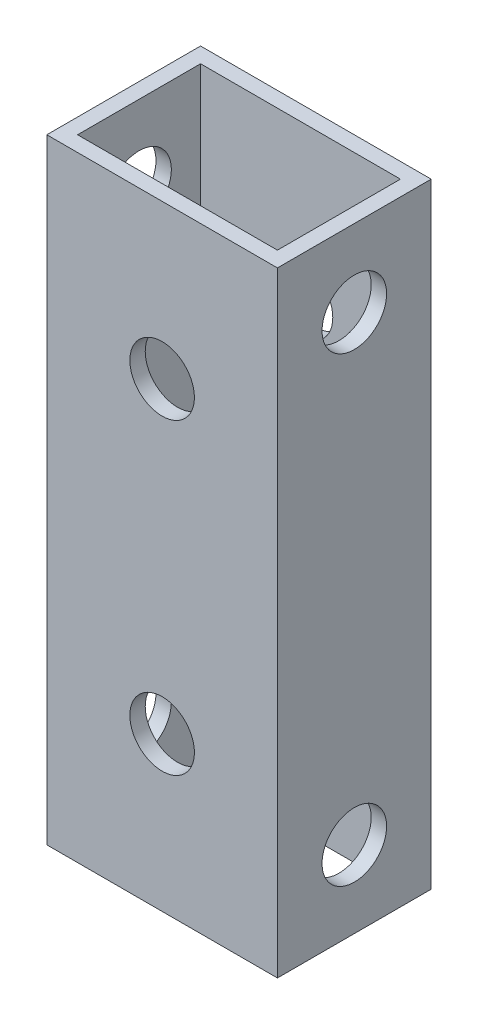
ISO-10303-21;
HEADER;
FILE_DESCRIPTION(('STEP AP214'),'2;1');
FILE_NAME('part.step','',(''),(''),'','','');
FILE_SCHEMA(('AUTOMOTIVE_DESIGN { 1 0 10303 214 1 1 1 1 }'));
ENDSEC;
DATA;
#1=APPLICATION_CONTEXT('core data for automotive mechanical design processes');
#2=APPLICATION_PROTOCOL_DEFINITION('international standard','automotive_design',2000,#1);
#3=PRODUCT_CONTEXT('',#1,'mechanical');
#4=PRODUCT('Part','Part','',(#3));
#5=PRODUCT_RELATED_PRODUCT_CATEGORY('part','',(#4));
#6=PRODUCT_DEFINITION_FORMATION('','',#4);
#7=PRODUCT_DEFINITION_CONTEXT('part definition',#1,'design');
#8=PRODUCT_DEFINITION('design','',#6,#7);
#9=PRODUCT_DEFINITION_SHAPE('','',#8);
#10=(LENGTH_UNIT() NAMED_UNIT(*) SI_UNIT(.MILLI.,.METRE.));
#11=(NAMED_UNIT(*) PLANE_ANGLE_UNIT() SI_UNIT($,.RADIAN.));
#12=(NAMED_UNIT(*) SI_UNIT($,.STERADIAN.) SOLID_ANGLE_UNIT());
#13=UNCERTAINTY_MEASURE_WITH_UNIT(LENGTH_MEASURE(1.E-05),#10,'distance_accuracy_value','');
#14=(GEOMETRIC_REPRESENTATION_CONTEXT(3) GLOBAL_UNCERTAINTY_ASSIGNED_CONTEXT((#13)) GLOBAL_UNIT_ASSIGNED_CONTEXT((#10,
#11,#12)) REPRESENTATION_CONTEXT('',''));
#15=CARTESIAN_POINT('',(0.,0.,0.));
#16=DIRECTION('',(0.,0.,1.));
#17=DIRECTION('',(1.,0.,0.));
#18=AXIS2_PLACEMENT_3D('',#15,#16,#17);
#19=CARTESIAN_POINT('',(0.,40.,0.));
#20=DIRECTION('',(0.,1.,0.));
#21=DIRECTION('',(0.,0.,1.));
#22=AXIS2_PLACEMENT_3D('',#19,#20,#21);
#23=PLANE('',#22);
#24=DIRECTION('',(0.,0.,-1.));
#25=VECTOR('',#24,1.);
#26=CARTESIAN_POINT('',(7.5,40.,-5.));
#27=LINE('',#26,#25);
#28=CARTESIAN_POINT('',(7.5,40.,5.));
#29=VERTEX_POINT('',#28);
#30=CARTESIAN_POINT('',(7.5,40.,-5.));
#31=VERTEX_POINT('',#30);
#32=EDGE_CURVE('E164',#29,#31,#27,.T.);
#33=ORIENTED_EDGE('',*,*,#32,.T.);
#34=DIRECTION('',(-1.,0.,0.));
#35=VECTOR('',#34,1.);
#36=CARTESIAN_POINT('',(-7.5,40.,-5.));
#37=LINE('',#36,#35);
#38=CARTESIAN_POINT('',(-7.5,40.,-5.));
#39=VERTEX_POINT('',#38);
#40=EDGE_CURVE('E167',#31,#39,#37,.T.);
#41=ORIENTED_EDGE('',*,*,#40,.T.);
#42=DIRECTION('',(0.,0.,1.));
#43=VECTOR('',#42,1.);
#44=CARTESIAN_POINT('',(-7.5,40.,-5.));
#45=LINE('',#44,#43);
#46=CARTESIAN_POINT('',(-7.5,40.,5.));
#47=VERTEX_POINT('',#46);
#48=EDGE_CURVE('E170',#39,#47,#45,.T.);
#49=ORIENTED_EDGE('',*,*,#48,.T.);
#50=DIRECTION('',(1.,0.,0.));
#51=VECTOR('',#50,1.);
#52=CARTESIAN_POINT('',(-7.5,40.,5.));
#53=LINE('',#52,#51);
#54=EDGE_CURVE('E172',#47,#29,#53,.T.);
#55=ORIENTED_EDGE('',*,*,#54,.T.);
#56=EDGE_LOOP('',(#33,#41,#49,#55));
#57=FACE_BOUND('',#56,.T.);
#58=DIRECTION('',(-1.,0.,0.));
#59=VECTOR('',#58,1.);
#60=CARTESIAN_POINT('',(-7.5,40.,-4.));
#61=LINE('',#60,#59);
#62=CARTESIAN_POINT('',(6.5,40.,-4.));
#63=VERTEX_POINT('',#62);
#64=CARTESIAN_POINT('',(-6.5,40.,-4.));
#65=VERTEX_POINT('',#64);
#66=EDGE_CURVE('E134',#63,#65,#61,.T.);
#67=ORIENTED_EDGE('',*,*,#66,.F.);
#68=DIRECTION('',(0.,0.,-1.));
#69=VECTOR('',#68,1.);
#70=CARTESIAN_POINT('',(6.5,40.,-5.));
#71=LINE('',#70,#69);
#72=CARTESIAN_POINT('',(6.5,40.,4.));
#73=VERTEX_POINT('',#72);
#74=EDGE_CURVE('E126',#73,#63,#71,.T.);
#75=ORIENTED_EDGE('',*,*,#74,.F.);
#76=DIRECTION('',(1.,0.,0.));
#77=VECTOR('',#76,1.);
#78=CARTESIAN_POINT('',(-7.5,40.,4.));
#79=LINE('',#78,#77);
#80=CARTESIAN_POINT('',(-6.5,40.,4.));
#81=VERTEX_POINT('',#80);
#82=EDGE_CURVE('E148',#81,#73,#79,.T.);
#83=ORIENTED_EDGE('',*,*,#82,.F.);
#84=DIRECTION('',(0.,0.,1.));
#85=VECTOR('',#84,1.);
#86=CARTESIAN_POINT('',(-6.5,40.,-5.));
#87=LINE('',#86,#85);
#88=EDGE_CURVE('E146',#65,#81,#87,.T.);
#89=ORIENTED_EDGE('',*,*,#88,.F.);
#90=EDGE_LOOP('',(#67,#75,#83,#89));
#91=FACE_BOUND('',#90,.T.);
#92=ADVANCED_FACE('F59',(#57,#91),#23,.T.);
#93=CARTESIAN_POINT('',(0.,0.,0.));
#94=DIRECTION('',(0.,1.,0.));
#95=DIRECTION('',(0.,0.,1.));
#96=AXIS2_PLACEMENT_3D('',#93,#94,#95);
#97=PLANE('',#96);
#98=DIRECTION('',(0.,0.,-1.));
#99=VECTOR('',#98,1.);
#100=CARTESIAN_POINT('',(7.5,0.,-5.));
#101=LINE('',#100,#99);
#102=CARTESIAN_POINT('',(7.5,0.,5.));
#103=VERTEX_POINT('',#102);
#104=CARTESIAN_POINT('',(7.5,0.,-5.));
#105=VERTEX_POINT('',#104);
#106=EDGE_CURVE('E142',#103,#105,#101,.T.);
#107=ORIENTED_EDGE('',*,*,#106,.F.);
#108=DIRECTION('',(1.,0.,0.));
#109=VECTOR('',#108,1.);
#110=CARTESIAN_POINT('',(-7.5,0.,5.));
#111=LINE('',#110,#109);
#112=CARTESIAN_POINT('',(-7.5,0.,5.));
#113=VERTEX_POINT('',#112);
#114=EDGE_CURVE('E168',#113,#103,#111,.T.);
#115=ORIENTED_EDGE('',*,*,#114,.F.);
#116=DIRECTION('',(0.,0.,1.));
#117=VECTOR('',#116,1.);
#118=CARTESIAN_POINT('',(-7.5,0.,-5.));
#119=LINE('',#118,#117);
#120=CARTESIAN_POINT('',(-7.5,0.,-5.));
#121=VERTEX_POINT('',#120);
#122=EDGE_CURVE('E179',#121,#113,#119,.T.);
#123=ORIENTED_EDGE('',*,*,#122,.F.);
#124=DIRECTION('',(-1.,0.,0.));
#125=VECTOR('',#124,1.);
#126=CARTESIAN_POINT('',(-7.5,0.,-5.));
#127=LINE('',#126,#125);
#128=EDGE_CURVE('E177',#105,#121,#127,.T.);
#129=ORIENTED_EDGE('',*,*,#128,.F.);
#130=EDGE_LOOP('',(#107,#115,#123,#129));
#131=FACE_BOUND('',#130,.T.);
#132=DIRECTION('',(0.,0.,-1.));
#133=VECTOR('',#132,1.);
#134=CARTESIAN_POINT('',(6.5,0.,-5.));
#135=LINE('',#134,#133);
#136=CARTESIAN_POINT('',(6.5,0.,4.));
#137=VERTEX_POINT('',#136);
#138=CARTESIAN_POINT('',(6.5,0.,-4.));
#139=VERTEX_POINT('',#138);
#140=EDGE_CURVE('E84',#137,#139,#135,.T.);
#141=ORIENTED_EDGE('',*,*,#140,.T.);
#142=DIRECTION('',(-1.,0.,0.));
#143=VECTOR('',#142,1.);
#144=CARTESIAN_POINT('',(-7.5,0.,-4.));
#145=LINE('',#144,#143);
#146=CARTESIAN_POINT('',(-6.5,0.,-4.));
#147=VERTEX_POINT('',#146);
#148=EDGE_CURVE('E141',#139,#147,#145,.T.);
#149=ORIENTED_EDGE('',*,*,#148,.T.);
#150=DIRECTION('',(0.,0.,1.));
#151=VECTOR('',#150,1.);
#152=CARTESIAN_POINT('',(-6.5,0.,-5.));
#153=LINE('',#152,#151);
#154=CARTESIAN_POINT('',(-6.5,0.,4.));
#155=VERTEX_POINT('',#154);
#156=EDGE_CURVE('E156',#147,#155,#153,.T.);
#157=ORIENTED_EDGE('',*,*,#156,.T.);
#158=DIRECTION('',(1.,0.,0.));
#159=VECTOR('',#158,1.);
#160=CARTESIAN_POINT('',(-7.5,0.,4.));
#161=LINE('',#160,#159);
#162=EDGE_CURVE('E135',#155,#137,#161,.T.);
#163=ORIENTED_EDGE('',*,*,#162,.T.);
#164=EDGE_LOOP('',(#141,#149,#157,#163));
#165=FACE_BOUND('',#164,.T.);
#166=ADVANCED_FACE('F256',(#131,#165),#97,.F.);
#167=CARTESIAN_POINT('',(7.5,40.,-5.));
#168=DIRECTION('',(-1.,0.,0.));
#169=DIRECTION('',(0.,0.,1.));
#170=AXIS2_PLACEMENT_3D('',#167,#168,#169);
#171=PLANE('',#170);
#172=CARTESIAN_POINT('',(7.5,35.,0.));
#173=DIRECTION('',(1.,0.,0.));
#174=DIRECTION('',(0.,0.,-1.));
#175=AXIS2_PLACEMENT_3D('',#172,#173,#174);
#176=CIRCLE('',#175,2.1);
#177=CARTESIAN_POINT('',(7.5,35.,-2.1));
#178=VERTEX_POINT('',#177);
#179=EDGE_CURVE('E224',#178,#178,#176,.T.);
#180=ORIENTED_EDGE('',*,*,#179,.F.);
#181=EDGE_LOOP('',(#180));
#182=FACE_BOUND('',#181,.T.);
#183=CARTESIAN_POINT('',(7.5,5.,0.));
#184=DIRECTION('',(1.,0.,0.));
#185=DIRECTION('',(0.,0.,1.));
#186=AXIS2_PLACEMENT_3D('',#183,#184,#185);
#187=CIRCLE('',#186,2.1);
#188=CARTESIAN_POINT('',(7.5,5.,-2.1));
#189=VERTEX_POINT('',#188);
#190=EDGE_CURVE('E221',#189,#189,#187,.T.);
#191=ORIENTED_EDGE('',*,*,#190,.F.);
#192=EDGE_LOOP('',(#191));
#193=FACE_BOUND('',#192,.T.);
#194=ORIENTED_EDGE('',*,*,#106,.T.);
#195=DIRECTION('',(0.,-1.,0.));
#196=VECTOR('',#195,1.);
#197=CARTESIAN_POINT('',(7.5,40.,-5.));
#198=LINE('',#197,#196);
#199=EDGE_CURVE('E12',#31,#105,#198,.T.);
#200=ORIENTED_EDGE('',*,*,#199,.F.);
#201=ORIENTED_EDGE('',*,*,#32,.F.);
#202=DIRECTION('',(0.,-1.,0.));
#203=VECTOR('',#202,1.);
#204=CARTESIAN_POINT('',(7.5,40.,5.));
#205=LINE('',#204,#203);
#206=EDGE_CURVE('E174',#29,#103,#205,.T.);
#207=ORIENTED_EDGE('',*,*,#206,.T.);
#208=EDGE_LOOP('',(#194,#200,#201,#207));
#209=FACE_BOUND('',#208,.T.);
#210=ADVANCED_FACE('F61',(#182,#193,#209),#171,.F.);
#211=CARTESIAN_POINT('',(-7.5,40.,-5.));
#212=DIRECTION('',(0.,0.,1.));
#213=DIRECTION('',(1.,0.,0.));
#214=AXIS2_PLACEMENT_3D('',#211,#212,#213);
#215=PLANE('',#214);
#216=CARTESIAN_POINT('',(0.,30.,-5.));
#217=DIRECTION('',(0.,0.,1.));
#218=DIRECTION('',(1.,0.,0.));
#219=AXIS2_PLACEMENT_3D('',#216,#217,#218);
#220=CIRCLE('',#219,2.1);
#221=CARTESIAN_POINT('',(2.1,30.,-5.));
#222=VERTEX_POINT('',#221);
#223=EDGE_CURVE('E199',#222,#222,#220,.T.);
#224=ORIENTED_EDGE('',*,*,#223,.T.);
#225=EDGE_LOOP('',(#224));
#226=FACE_BOUND('',#225,.T.);
#227=CARTESIAN_POINT('',(0.,10.,-5.));
#228=DIRECTION('',(0.,0.,1.));
#229=DIRECTION('',(-1.,0.,0.));
#230=AXIS2_PLACEMENT_3D('',#227,#228,#229);
#231=CIRCLE('',#230,2.1);
#232=CARTESIAN_POINT('',(-2.1,10.,-5.));
#233=VERTEX_POINT('',#232);
#234=EDGE_CURVE('E210',#233,#233,#231,.T.);
#235=ORIENTED_EDGE('',*,*,#234,.T.);
#236=EDGE_LOOP('',(#235));
#237=FACE_BOUND('',#236,.T.);
#238=ORIENTED_EDGE('',*,*,#128,.T.);
#239=DIRECTION('',(0.,-1.,0.));
#240=VECTOR('',#239,1.);
#241=CARTESIAN_POINT('',(-7.5,40.,-5.));
#242=LINE('',#241,#240);
#243=EDGE_CURVE('E68',#39,#121,#242,.T.);
#244=ORIENTED_EDGE('',*,*,#243,.F.);
#245=ORIENTED_EDGE('',*,*,#40,.F.);
#246=ORIENTED_EDGE('',*,*,#199,.T.);
#247=EDGE_LOOP('',(#238,#244,#245,#246));
#248=FACE_BOUND('',#247,.T.);
#249=ADVANCED_FACE('F255',(#226,#237,#248),#215,.F.);
#250=CARTESIAN_POINT('',(-7.5,40.,-5.));
#251=DIRECTION('',(1.,0.,0.));
#252=DIRECTION('',(0.,0.,-1.));
#253=AXIS2_PLACEMENT_3D('',#250,#251,#252);
#254=PLANE('',#253);
#255=CARTESIAN_POINT('',(-7.5,35.,0.));
#256=DIRECTION('',(1.,0.,0.));
#257=DIRECTION('',(0.,0.,-1.));
#258=AXIS2_PLACEMENT_3D('',#255,#256,#257);
#259=CIRCLE('',#258,2.1);
#260=CARTESIAN_POINT('',(-7.5,35.,-2.1));
#261=VERTEX_POINT('',#260);
#262=EDGE_CURVE('E193',#261,#261,#259,.T.);
#263=ORIENTED_EDGE('',*,*,#262,.T.);
#264=EDGE_LOOP('',(#263));
#265=FACE_BOUND('',#264,.T.);
#266=CARTESIAN_POINT('',(-7.5,5.,0.));
#267=DIRECTION('',(1.,0.,0.));
#268=DIRECTION('',(0.,0.,1.));
#269=AXIS2_PLACEMENT_3D('',#266,#267,#268);
#270=CIRCLE('',#269,2.1);
#271=CARTESIAN_POINT('',(-7.5,5.,-2.1));
#272=VERTEX_POINT('',#271);
#273=EDGE_CURVE('E227',#272,#272,#270,.T.);
#274=ORIENTED_EDGE('',*,*,#273,.T.);
#275=EDGE_LOOP('',(#274));
#276=FACE_BOUND('',#275,.T.);
#277=ORIENTED_EDGE('',*,*,#122,.T.);
#278=DIRECTION('',(0.,-1.,0.));
#279=VECTOR('',#278,1.);
#280=CARTESIAN_POINT('',(-7.5,40.,5.));
#281=LINE('',#280,#279);
#282=EDGE_CURVE('E184',#47,#113,#281,.T.);
#283=ORIENTED_EDGE('',*,*,#282,.F.);
#284=ORIENTED_EDGE('',*,*,#48,.F.);
#285=ORIENTED_EDGE('',*,*,#243,.T.);
#286=EDGE_LOOP('',(#277,#283,#284,#285));
#287=FACE_BOUND('',#286,.T.);
#288=ADVANCED_FACE('F274',(#265,#276,#287),#254,.F.);
#289=CARTESIAN_POINT('',(-7.5,40.,5.));
#290=DIRECTION('',(0.,0.,-1.));
#291=DIRECTION('',(-1.,0.,0.));
#292=AXIS2_PLACEMENT_3D('',#289,#290,#291);
#293=PLANE('',#292);
#294=CARTESIAN_POINT('',(0.,30.,5.));
#295=DIRECTION('',(0.,0.,1.));
#296=DIRECTION('',(1.,0.,0.));
#297=AXIS2_PLACEMENT_3D('',#294,#295,#296);
#298=CIRCLE('',#297,2.1);
#299=CARTESIAN_POINT('',(2.1,30.,5.));
#300=VERTEX_POINT('',#299);
#301=EDGE_CURVE('E205',#300,#300,#298,.T.);
#302=ORIENTED_EDGE('',*,*,#301,.F.);
#303=EDGE_LOOP('',(#302));
#304=FACE_BOUND('',#303,.T.);
#305=CARTESIAN_POINT('',(0.,10.,5.));
#306=DIRECTION('',(0.,0.,1.));
#307=DIRECTION('',(-1.,0.,0.));
#308=AXIS2_PLACEMENT_3D('',#305,#306,#307);
#309=CIRCLE('',#308,2.1);
#310=CARTESIAN_POINT('',(-2.1,10.,5.));
#311=VERTEX_POINT('',#310);
#312=EDGE_CURVE('E215',#311,#311,#309,.T.);
#313=ORIENTED_EDGE('',*,*,#312,.F.);
#314=EDGE_LOOP('',(#313));
#315=FACE_BOUND('',#314,.T.);
#316=ORIENTED_EDGE('',*,*,#114,.T.);
#317=ORIENTED_EDGE('',*,*,#206,.F.);
#318=ORIENTED_EDGE('',*,*,#54,.F.);
#319=ORIENTED_EDGE('',*,*,#282,.T.);
#320=EDGE_LOOP('',(#316,#317,#318,#319));
#321=FACE_BOUND('',#320,.T.);
#322=ADVANCED_FACE('F241',(#304,#315,#321),#293,.F.);
#323=CARTESIAN_POINT('',(6.5,40.,-5.));
#324=DIRECTION('',(-1.,0.,0.));
#325=DIRECTION('',(0.,0.,1.));
#326=AXIS2_PLACEMENT_3D('',#323,#324,#325);
#327=PLANE('',#326);
#328=CARTESIAN_POINT('',(6.5,35.,0.));
#329=DIRECTION('',(-1.,0.,0.));
#330=DIRECTION('',(0.,0.,1.));
#331=AXIS2_PLACEMENT_3D('',#328,#329,#330);
#332=CIRCLE('',#331,2.1);
#333=CARTESIAN_POINT('',(6.5,35.,-2.1));
#334=VERTEX_POINT('',#333);
#335=EDGE_CURVE('E154',#334,#334,#332,.T.);
#336=ORIENTED_EDGE('',*,*,#335,.F.);
#337=EDGE_LOOP('',(#336));
#338=FACE_BOUND('',#337,.T.);
#339=CARTESIAN_POINT('',(6.5,5.,0.));
#340=DIRECTION('',(-1.,0.,0.));
#341=DIRECTION('',(0.,0.,1.));
#342=AXIS2_PLACEMENT_3D('',#339,#340,#341);
#343=CIRCLE('',#342,2.1);
#344=CARTESIAN_POINT('',(6.5,5.,-2.1));
#345=VERTEX_POINT('',#344);
#346=EDGE_CURVE('E192',#345,#345,#343,.T.);
#347=ORIENTED_EDGE('',*,*,#346,.F.);
#348=EDGE_LOOP('',(#347));
#349=FACE_BOUND('',#348,.T.);
#350=ORIENTED_EDGE('',*,*,#140,.F.);
#351=DIRECTION('',(0.,-1.,0.));
#352=VECTOR('',#351,1.);
#353=CARTESIAN_POINT('',(6.5,40.,4.));
#354=LINE('',#353,#352);
#355=EDGE_CURVE('E130',#73,#137,#354,.T.);
#356=ORIENTED_EDGE('',*,*,#355,.F.);
#357=ORIENTED_EDGE('',*,*,#74,.T.);
#358=DIRECTION('',(0.,-1.,0.));
#359=VECTOR('',#358,1.);
#360=CARTESIAN_POINT('',(6.5,40.,-4.));
#361=LINE('',#360,#359);
#362=EDGE_CURVE('E129',#63,#139,#361,.T.);
#363=ORIENTED_EDGE('',*,*,#362,.T.);
#364=EDGE_LOOP('',(#350,#356,#357,#363));
#365=FACE_BOUND('',#364,.T.);
#366=ADVANCED_FACE('F128',(#338,#349,#365),#327,.T.);
#367=CARTESIAN_POINT('',(-7.5,40.,-4.));
#368=DIRECTION('',(0.,0.,1.));
#369=DIRECTION('',(1.,0.,0.));
#370=AXIS2_PLACEMENT_3D('',#367,#368,#369);
#371=PLANE('',#370);
#372=CARTESIAN_POINT('',(0.,30.,-4.));
#373=DIRECTION('',(0.,0.,1.));
#374=DIRECTION('',(1.,0.,0.));
#375=AXIS2_PLACEMENT_3D('',#372,#373,#374);
#376=CIRCLE('',#375,2.1);
#377=CARTESIAN_POINT('',(2.1,30.,-4.));
#378=VERTEX_POINT('',#377);
#379=EDGE_CURVE('E218',#378,#378,#376,.T.);
#380=ORIENTED_EDGE('',*,*,#379,.F.);
#381=EDGE_LOOP('',(#380));
#382=FACE_BOUND('',#381,.T.);
#383=CARTESIAN_POINT('',(0.,10.,-4.));
#384=DIRECTION('',(0.,0.,1.));
#385=DIRECTION('',(1.,0.,0.));
#386=AXIS2_PLACEMENT_3D('',#383,#384,#385);
#387=CIRCLE('',#386,2.1);
#388=CARTESIAN_POINT('',(2.1,10.,-4.));
#389=VERTEX_POINT('',#388);
#390=EDGE_CURVE('E198',#389,#389,#387,.T.);
#391=ORIENTED_EDGE('',*,*,#390,.F.);
#392=EDGE_LOOP('',(#391));
#393=FACE_BOUND('',#392,.T.);
#394=ORIENTED_EDGE('',*,*,#148,.F.);
#395=ORIENTED_EDGE('',*,*,#362,.F.);
#396=ORIENTED_EDGE('',*,*,#66,.T.);
#397=DIRECTION('',(0.,-1.,0.));
#398=VECTOR('',#397,1.);
#399=CARTESIAN_POINT('',(-6.5,40.,-4.));
#400=LINE('',#399,#398);
#401=EDGE_CURVE('E143',#65,#147,#400,.T.);
#402=ORIENTED_EDGE('',*,*,#401,.T.);
#403=EDGE_LOOP('',(#394,#395,#396,#402));
#404=FACE_BOUND('',#403,.T.);
#405=ADVANCED_FACE('F138',(#382,#393,#404),#371,.T.);
#406=CARTESIAN_POINT('',(-6.5,40.,-5.));
#407=DIRECTION('',(1.,0.,0.));
#408=DIRECTION('',(0.,0.,-1.));
#409=AXIS2_PLACEMENT_3D('',#406,#407,#408);
#410=PLANE('',#409);
#411=CARTESIAN_POINT('',(-6.5,35.,0.));
#412=DIRECTION('',(1.,0.,0.));
#413=DIRECTION('',(0.,0.,-1.));
#414=AXIS2_PLACEMENT_3D('',#411,#412,#413);
#415=CIRCLE('',#414,2.1);
#416=CARTESIAN_POINT('',(-6.5,35.,-2.1));
#417=VERTEX_POINT('',#416);
#418=EDGE_CURVE('E194',#417,#417,#415,.T.);
#419=ORIENTED_EDGE('',*,*,#418,.F.);
#420=EDGE_LOOP('',(#419));
#421=FACE_BOUND('',#420,.T.);
#422=CARTESIAN_POINT('',(-6.5,5.,0.));
#423=DIRECTION('',(1.,0.,0.));
#424=DIRECTION('',(0.,0.,-1.));
#425=AXIS2_PLACEMENT_3D('',#422,#423,#424);
#426=CIRCLE('',#425,2.1);
#427=CARTESIAN_POINT('',(-6.5,5.,-2.1));
#428=VERTEX_POINT('',#427);
#429=EDGE_CURVE('E189',#428,#428,#426,.T.);
#430=ORIENTED_EDGE('',*,*,#429,.F.);
#431=EDGE_LOOP('',(#430));
#432=FACE_BOUND('',#431,.T.);
#433=ORIENTED_EDGE('',*,*,#156,.F.);
#434=ORIENTED_EDGE('',*,*,#401,.F.);
#435=ORIENTED_EDGE('',*,*,#88,.T.);
#436=DIRECTION('',(0.,-1.,0.));
#437=VECTOR('',#436,1.);
#438=CARTESIAN_POINT('',(-6.5,40.,4.));
#439=LINE('',#438,#437);
#440=EDGE_CURVE('E76',#81,#155,#439,.T.);
#441=ORIENTED_EDGE('',*,*,#440,.T.);
#442=EDGE_LOOP('',(#433,#434,#435,#441));
#443=FACE_BOUND('',#442,.T.);
#444=ADVANCED_FACE('F294',(#421,#432,#443),#410,.T.);
#445=CARTESIAN_POINT('',(-7.5,40.,4.));
#446=DIRECTION('',(0.,0.,-1.));
#447=DIRECTION('',(-1.,0.,0.));
#448=AXIS2_PLACEMENT_3D('',#445,#446,#447);
#449=PLANE('',#448);
#450=CARTESIAN_POINT('',(0.,30.,4.));
#451=DIRECTION('',(0.,0.,-1.));
#452=DIRECTION('',(-1.,0.,0.));
#453=AXIS2_PLACEMENT_3D('',#450,#451,#452);
#454=CIRCLE('',#453,2.1);
#455=CARTESIAN_POINT('',(-2.1,30.,4.));
#456=VERTEX_POINT('',#455);
#457=EDGE_CURVE('E63',#456,#456,#454,.T.);
#458=ORIENTED_EDGE('',*,*,#457,.F.);
#459=EDGE_LOOP('',(#458));
#460=FACE_BOUND('',#459,.T.);
#461=CARTESIAN_POINT('',(0.,10.,4.));
#462=DIRECTION('',(0.,0.,-1.));
#463=DIRECTION('',(-1.,0.,0.));
#464=AXIS2_PLACEMENT_3D('',#461,#462,#463);
#465=CIRCLE('',#464,2.1);
#466=CARTESIAN_POINT('',(-2.1,10.,4.));
#467=VERTEX_POINT('',#466);
#468=EDGE_CURVE('E196',#467,#467,#465,.T.);
#469=ORIENTED_EDGE('',*,*,#468,.F.);
#470=EDGE_LOOP('',(#469));
#471=FACE_BOUND('',#470,.T.);
#472=ORIENTED_EDGE('',*,*,#162,.F.);
#473=ORIENTED_EDGE('',*,*,#440,.F.);
#474=ORIENTED_EDGE('',*,*,#82,.T.);
#475=ORIENTED_EDGE('',*,*,#355,.T.);
#476=EDGE_LOOP('',(#472,#473,#474,#475));
#477=FACE_BOUND('',#476,.T.);
#478=ADVANCED_FACE('F298',(#460,#471,#477),#449,.T.);
#479=CARTESIAN_POINT('',(-7.5,5.,0.));
#480=DIRECTION('',(1.,0.,0.));
#481=DIRECTION('',(0.,0.,-1.));
#482=AXIS2_PLACEMENT_3D('',#479,#480,#481);
#483=CYLINDRICAL_SURFACE('',#482,2.1);
#484=CARTESIAN_POINT('',(-6.5,5.,-2.1));
#485=CARTESIAN_POINT('',(-6.51041666666667,5.,-2.1));
#486=CARTESIAN_POINT('',(-6.52083333333333,5.,-2.1));
#487=CARTESIAN_POINT('',(-6.54166666666667,5.,-2.1));
#488=CARTESIAN_POINT('',(-6.55208333333333,5.,-2.1));
#489=CARTESIAN_POINT('',(-6.57291666666667,5.,-2.1));
#490=CARTESIAN_POINT('',(-6.58333333333333,5.,-2.1));
#491=CARTESIAN_POINT('',(-6.60416666666667,5.,-2.1));
#492=CARTESIAN_POINT('',(-6.61458333333333,5.,-2.1));
#493=CARTESIAN_POINT('',(-6.63541666666667,5.,-2.1));
#494=CARTESIAN_POINT('',(-6.64583333333333,5.,-2.1));
#495=CARTESIAN_POINT('',(-6.66666666666667,5.,-2.1));
#496=CARTESIAN_POINT('',(-6.67708333333333,5.,-2.1));
#497=CARTESIAN_POINT('',(-6.69791666666667,5.,-2.1));
#498=CARTESIAN_POINT('',(-6.70833333333333,5.,-2.1));
#499=CARTESIAN_POINT('',(-6.72916666666667,5.,-2.1));
#500=CARTESIAN_POINT('',(-6.73958333333333,5.,-2.1));
#501=CARTESIAN_POINT('',(-6.76041666666667,5.,-2.1));
#502=CARTESIAN_POINT('',(-6.77083333333333,5.,-2.1));
#503=CARTESIAN_POINT('',(-6.79166666666667,5.,-2.1));
#504=CARTESIAN_POINT('',(-6.80208333333333,5.,-2.1));
#505=CARTESIAN_POINT('',(-6.82291666666667,5.,-2.1));
#506=CARTESIAN_POINT('',(-6.83333333333333,5.,-2.1));
#507=CARTESIAN_POINT('',(-6.85416666666667,5.,-2.1));
#508=CARTESIAN_POINT('',(-6.86458333333333,5.,-2.1));
#509=CARTESIAN_POINT('',(-6.88541666666667,5.,-2.1));
#510=CARTESIAN_POINT('',(-6.89583333333333,5.,-2.1));
#511=CARTESIAN_POINT('',(-6.91666666666667,5.,-2.1));
#512=CARTESIAN_POINT('',(-6.92708333333333,5.,-2.1));
#513=CARTESIAN_POINT('',(-6.94791666666667,5.,-2.1));
#514=CARTESIAN_POINT('',(-6.95833333333333,5.,-2.1));
#515=CARTESIAN_POINT('',(-6.97916666666667,5.,-2.1));
#516=CARTESIAN_POINT('',(-6.98958333333333,5.,-2.1));
#517=CARTESIAN_POINT('',(-7.01041666666667,5.,-2.1));
#518=CARTESIAN_POINT('',(-7.02083333333333,5.,-2.1));
#519=CARTESIAN_POINT('',(-7.04166666666667,5.,-2.1));
#520=CARTESIAN_POINT('',(-7.05208333333333,5.,-2.1));
#521=CARTESIAN_POINT('',(-7.07291666666667,5.,-2.1));
#522=CARTESIAN_POINT('',(-7.08333333333333,5.,-2.1));
#523=CARTESIAN_POINT('',(-7.10416666666667,5.,-2.1));
#524=CARTESIAN_POINT('',(-7.11458333333333,5.,-2.1));
#525=CARTESIAN_POINT('',(-7.13541666666667,5.,-2.1));
#526=CARTESIAN_POINT('',(-7.14583333333333,5.,-2.1));
#527=CARTESIAN_POINT('',(-7.16666666666667,5.,-2.1));
#528=CARTESIAN_POINT('',(-7.17708333333333,5.,-2.1));
#529=CARTESIAN_POINT('',(-7.19791666666667,5.,-2.1));
#530=CARTESIAN_POINT('',(-7.20833333333333,5.,-2.1));
#531=CARTESIAN_POINT('',(-7.22916666666667,5.,-2.1));
#532=CARTESIAN_POINT('',(-7.23958333333333,5.,-2.1));
#533=CARTESIAN_POINT('',(-7.26041666666667,5.,-2.1));
#534=CARTESIAN_POINT('',(-7.27083333333333,5.,-2.1));
#535=CARTESIAN_POINT('',(-7.29166666666667,5.,-2.1));
#536=CARTESIAN_POINT('',(-7.30208333333333,5.,-2.1));
#537=CARTESIAN_POINT('',(-7.32291666666667,5.,-2.1));
#538=CARTESIAN_POINT('',(-7.33333333333333,5.,-2.1));
#539=CARTESIAN_POINT('',(-7.35416666666667,5.,-2.1));
#540=CARTESIAN_POINT('',(-7.36458333333333,5.,-2.1));
#541=CARTESIAN_POINT('',(-7.38541666666667,5.,-2.1));
#542=CARTESIAN_POINT('',(-7.39583333333333,5.,-2.1));
#543=CARTESIAN_POINT('',(-7.41666666666667,5.,-2.1));
#544=CARTESIAN_POINT('',(-7.42708333333333,5.,-2.1));
#545=CARTESIAN_POINT('',(-7.44791666666667,5.,-2.1));
#546=CARTESIAN_POINT('',(-7.45833333333333,5.,-2.1));
#547=CARTESIAN_POINT('',(-7.47916666666667,5.,-2.1));
#548=CARTESIAN_POINT('',(-7.48958333333333,5.,-2.1));
#549=CARTESIAN_POINT('',(-7.5,5.,-2.1));
#550=B_SPLINE_CURVE_WITH_KNOTS('',3,(#484,#485,#486,#487,#488,#489,#490,#491,#492,#493,#494,
#495,#496,#497,#498,#499,#500,#501,#502,#503,#504,#505,#506,#507,#508,#509,#510,#511,#512,#513,
#514,#515,#516,#517,#518,#519,#520,#521,#522,#523,#524,#525,#526,#527,#528,#529,#530,#531,#532,
#533,#534,#535,#536,#537,#538,#539,#540,#541,#542,#543,#544,#545,#546,#547,#548,#549),
.UNSPECIFIED.,.F.,.F.,(4,2,2,2,2,2,2,2,2,2,2,2,2,2,2,2,2,2,2,2,2,2,2,2,2,2,2,2,2,2,2,2,4),(0.,
0.03125,0.0625000000000001,0.0937500000000001,0.125,0.15625,0.1875,0.21875,0.25,0.28125,0.3125,
0.34375,0.375,0.40625,0.4375,0.46875,0.5,0.53125,0.5625,0.593750000000001,0.625000000000001,
0.656250000000001,0.687500000000001,0.718750000000001,0.750000000000001,0.781250000000001,
0.812500000000001,0.843750000000001,0.875000000000001,0.906250000000001,0.937500000000002,
0.968750000000002,1.),.UNSPECIFIED.);
#551=EDGE_CURVE('BSEAM250',#428,#272,#550,.T.);
#552=ORIENTED_EDGE('',*,*,#429,.T.);
#553=ORIENTED_EDGE('',*,*,#273,.F.);
#554=ORIENTED_EDGE('',*,*,#551,.T.);
#555=ORIENTED_EDGE('',*,*,#551,.F.);
#556=EDGE_LOOP('',(#552,#554,#553,#555));
#557=FACE_BOUND('',#556,.T.);
#558=ADVANCED_FACE('F250',(#557),#483,.F.);
#559=CARTESIAN_POINT('',(-7.5,35.,0.));
#560=DIRECTION('',(1.,0.,0.));
#561=DIRECTION('',(0.,0.,-1.));
#562=AXIS2_PLACEMENT_3D('',#559,#560,#561);
#563=CYLINDRICAL_SURFACE('',#562,2.1);
#564=CARTESIAN_POINT('',(-6.5,35.,-2.1));
#565=CARTESIAN_POINT('',(-6.51041666666667,35.,-2.1));
#566=CARTESIAN_POINT('',(-6.52083333333333,35.,-2.1));
#567=CARTESIAN_POINT('',(-6.54166666666667,35.,-2.1));
#568=CARTESIAN_POINT('',(-6.55208333333333,35.,-2.1));
#569=CARTESIAN_POINT('',(-6.57291666666667,35.,-2.1));
#570=CARTESIAN_POINT('',(-6.58333333333333,35.,-2.1));
#571=CARTESIAN_POINT('',(-6.60416666666667,35.,-2.1));
#572=CARTESIAN_POINT('',(-6.61458333333333,35.,-2.1));
#573=CARTESIAN_POINT('',(-6.63541666666667,35.,-2.1));
#574=CARTESIAN_POINT('',(-6.64583333333333,35.,-2.1));
#575=CARTESIAN_POINT('',(-6.66666666666667,35.,-2.1));
#576=CARTESIAN_POINT('',(-6.67708333333333,35.,-2.1));
#577=CARTESIAN_POINT('',(-6.69791666666667,35.,-2.1));
#578=CARTESIAN_POINT('',(-6.70833333333333,35.,-2.1));
#579=CARTESIAN_POINT('',(-6.72916666666667,35.,-2.1));
#580=CARTESIAN_POINT('',(-6.73958333333333,35.,-2.1));
#581=CARTESIAN_POINT('',(-6.76041666666667,35.,-2.1));
#582=CARTESIAN_POINT('',(-6.77083333333333,35.,-2.1));
#583=CARTESIAN_POINT('',(-6.79166666666667,35.,-2.1));
#584=CARTESIAN_POINT('',(-6.80208333333333,35.,-2.1));
#585=CARTESIAN_POINT('',(-6.82291666666667,35.,-2.1));
#586=CARTESIAN_POINT('',(-6.83333333333333,35.,-2.1));
#587=CARTESIAN_POINT('',(-6.85416666666667,35.,-2.1));
#588=CARTESIAN_POINT('',(-6.86458333333333,35.,-2.1));
#589=CARTESIAN_POINT('',(-6.88541666666667,35.,-2.1));
#590=CARTESIAN_POINT('',(-6.89583333333333,35.,-2.1));
#591=CARTESIAN_POINT('',(-6.91666666666667,35.,-2.1));
#592=CARTESIAN_POINT('',(-6.92708333333333,35.,-2.1));
#593=CARTESIAN_POINT('',(-6.94791666666667,35.,-2.1));
#594=CARTESIAN_POINT('',(-6.95833333333333,35.,-2.1));
#595=CARTESIAN_POINT('',(-6.97916666666667,35.,-2.1));
#596=CARTESIAN_POINT('',(-6.98958333333333,35.,-2.1));
#597=CARTESIAN_POINT('',(-7.01041666666667,35.,-2.1));
#598=CARTESIAN_POINT('',(-7.02083333333333,35.,-2.1));
#599=CARTESIAN_POINT('',(-7.04166666666667,35.,-2.1));
#600=CARTESIAN_POINT('',(-7.05208333333333,35.,-2.1));
#601=CARTESIAN_POINT('',(-7.07291666666667,35.,-2.1));
#602=CARTESIAN_POINT('',(-7.08333333333333,35.,-2.1));
#603=CARTESIAN_POINT('',(-7.10416666666667,35.,-2.1));
#604=CARTESIAN_POINT('',(-7.11458333333333,35.,-2.1));
#605=CARTESIAN_POINT('',(-7.13541666666667,35.,-2.1));
#606=CARTESIAN_POINT('',(-7.14583333333333,35.,-2.1));
#607=CARTESIAN_POINT('',(-7.16666666666667,35.,-2.1));
#608=CARTESIAN_POINT('',(-7.17708333333333,35.,-2.1));
#609=CARTESIAN_POINT('',(-7.19791666666667,35.,-2.1));
#610=CARTESIAN_POINT('',(-7.20833333333333,35.,-2.1));
#611=CARTESIAN_POINT('',(-7.22916666666667,35.,-2.1));
#612=CARTESIAN_POINT('',(-7.23958333333333,35.,-2.1));
#613=CARTESIAN_POINT('',(-7.26041666666667,35.,-2.1));
#614=CARTESIAN_POINT('',(-7.27083333333333,35.,-2.1));
#615=CARTESIAN_POINT('',(-7.29166666666667,35.,-2.1));
#616=CARTESIAN_POINT('',(-7.30208333333333,35.,-2.1));
#617=CARTESIAN_POINT('',(-7.32291666666667,35.,-2.1));
#618=CARTESIAN_POINT('',(-7.33333333333333,35.,-2.1));
#619=CARTESIAN_POINT('',(-7.35416666666667,35.,-2.1));
#620=CARTESIAN_POINT('',(-7.36458333333333,35.,-2.1));
#621=CARTESIAN_POINT('',(-7.38541666666667,35.,-2.1));
#622=CARTESIAN_POINT('',(-7.39583333333333,35.,-2.1));
#623=CARTESIAN_POINT('',(-7.41666666666667,35.,-2.1));
#624=CARTESIAN_POINT('',(-7.42708333333333,35.,-2.1));
#625=CARTESIAN_POINT('',(-7.44791666666667,35.,-2.1));
#626=CARTESIAN_POINT('',(-7.45833333333333,35.,-2.1));
#627=CARTESIAN_POINT('',(-7.47916666666667,35.,-2.1));
#628=CARTESIAN_POINT('',(-7.48958333333333,35.,-2.1));
#629=CARTESIAN_POINT('',(-7.5,35.,-2.1));
#630=B_SPLINE_CURVE_WITH_KNOTS('',3,(#564,#565,#566,#567,#568,#569,#570,#571,#572,#573,#574,
#575,#576,#577,#578,#579,#580,#581,#582,#583,#584,#585,#586,#587,#588,#589,#590,#591,#592,#593,
#594,#595,#596,#597,#598,#599,#600,#601,#602,#603,#604,#605,#606,#607,#608,#609,#610,#611,#612,
#613,#614,#615,#616,#617,#618,#619,#620,#621,#622,#623,#624,#625,#626,#627,#628,#629),
.UNSPECIFIED.,.F.,.F.,(4,2,2,2,2,2,2,2,2,2,2,2,2,2,2,2,2,2,2,2,2,2,2,2,2,2,2,2,2,2,2,2,4),(0.,
0.03125,0.0625000000000001,0.0937500000000001,0.125,0.15625,0.1875,0.21875,0.25,0.28125,0.3125,
0.34375,0.375,0.40625,0.4375,0.46875,0.5,0.53125,0.5625,0.593750000000001,0.625000000000001,
0.656250000000001,0.687500000000001,0.718750000000001,0.750000000000001,0.781250000000001,
0.812500000000001,0.843750000000001,0.875000000000001,0.906250000000001,0.937500000000002,
0.968750000000002,1.),.UNSPECIFIED.);
#631=EDGE_CURVE('BSEAM248',#417,#261,#630,.T.);
#632=ORIENTED_EDGE('',*,*,#418,.T.);
#633=ORIENTED_EDGE('',*,*,#262,.F.);
#634=ORIENTED_EDGE('',*,*,#631,.T.);
#635=ORIENTED_EDGE('',*,*,#631,.F.);
#636=EDGE_LOOP('',(#632,#634,#633,#635));
#637=FACE_BOUND('',#636,.T.);
#638=ADVANCED_FACE('F248',(#637),#563,.F.);
#639=CARTESIAN_POINT('',(6.5,5.,-2.1));
#640=CARTESIAN_POINT('',(6.51041666666667,5.,-2.1));
#641=CARTESIAN_POINT('',(6.52083333333333,5.,-2.1));
#642=CARTESIAN_POINT('',(6.54166666666667,5.,-2.1));
#643=CARTESIAN_POINT('',(6.55208333333333,5.,-2.1));
#644=CARTESIAN_POINT('',(6.57291666666667,5.,-2.1));
#645=CARTESIAN_POINT('',(6.58333333333333,5.,-2.1));
#646=CARTESIAN_POINT('',(6.60416666666667,5.,-2.1));
#647=CARTESIAN_POINT('',(6.61458333333333,5.,-2.1));
#648=CARTESIAN_POINT('',(6.63541666666667,5.,-2.1));
#649=CARTESIAN_POINT('',(6.64583333333333,5.,-2.1));
#650=CARTESIAN_POINT('',(6.66666666666667,5.,-2.1));
#651=CARTESIAN_POINT('',(6.67708333333333,5.,-2.1));
#652=CARTESIAN_POINT('',(6.69791666666667,5.,-2.1));
#653=CARTESIAN_POINT('',(6.70833333333333,5.,-2.1));
#654=CARTESIAN_POINT('',(6.72916666666667,5.,-2.1));
#655=CARTESIAN_POINT('',(6.73958333333333,5.,-2.1));
#656=CARTESIAN_POINT('',(6.76041666666667,5.,-2.1));
#657=CARTESIAN_POINT('',(6.77083333333333,5.,-2.1));
#658=CARTESIAN_POINT('',(6.79166666666667,5.,-2.1));
#659=CARTESIAN_POINT('',(6.80208333333333,5.,-2.1));
#660=CARTESIAN_POINT('',(6.82291666666667,5.,-2.1));
#661=CARTESIAN_POINT('',(6.83333333333333,5.,-2.1));
#662=CARTESIAN_POINT('',(6.85416666666667,5.,-2.1));
#663=CARTESIAN_POINT('',(6.86458333333333,5.,-2.1));
#664=CARTESIAN_POINT('',(6.88541666666667,5.,-2.1));
#665=CARTESIAN_POINT('',(6.89583333333333,5.,-2.1));
#666=CARTESIAN_POINT('',(6.91666666666667,5.,-2.1));
#667=CARTESIAN_POINT('',(6.92708333333333,5.,-2.1));
#668=CARTESIAN_POINT('',(6.94791666666667,5.,-2.1));
#669=CARTESIAN_POINT('',(6.95833333333333,5.,-2.1));
#670=CARTESIAN_POINT('',(6.97916666666667,5.,-2.1));
#671=CARTESIAN_POINT('',(6.98958333333333,5.,-2.1));
#672=CARTESIAN_POINT('',(7.01041666666667,5.,-2.1));
#673=CARTESIAN_POINT('',(7.02083333333333,5.,-2.1));
#674=CARTESIAN_POINT('',(7.04166666666667,5.,-2.1));
#675=CARTESIAN_POINT('',(7.05208333333333,5.,-2.1));
#676=CARTESIAN_POINT('',(7.07291666666667,5.,-2.1));
#677=CARTESIAN_POINT('',(7.08333333333333,5.,-2.1));
#678=CARTESIAN_POINT('',(7.10416666666667,5.,-2.1));
#679=CARTESIAN_POINT('',(7.11458333333333,5.,-2.1));
#680=CARTESIAN_POINT('',(7.13541666666667,5.,-2.1));
#681=CARTESIAN_POINT('',(7.14583333333333,5.,-2.1));
#682=CARTESIAN_POINT('',(7.16666666666667,5.,-2.1));
#683=CARTESIAN_POINT('',(7.17708333333333,5.,-2.1));
#684=CARTESIAN_POINT('',(7.19791666666667,5.,-2.1));
#685=CARTESIAN_POINT('',(7.20833333333333,5.,-2.1));
#686=CARTESIAN_POINT('',(7.22916666666667,5.,-2.1));
#687=CARTESIAN_POINT('',(7.23958333333333,5.,-2.1));
#688=CARTESIAN_POINT('',(7.26041666666667,5.,-2.1));
#689=CARTESIAN_POINT('',(7.27083333333333,5.,-2.1));
#690=CARTESIAN_POINT('',(7.29166666666667,5.,-2.1));
#691=CARTESIAN_POINT('',(7.30208333333333,5.,-2.1));
#692=CARTESIAN_POINT('',(7.32291666666667,5.,-2.1));
#693=CARTESIAN_POINT('',(7.33333333333333,5.,-2.1));
#694=CARTESIAN_POINT('',(7.35416666666667,5.,-2.1));
#695=CARTESIAN_POINT('',(7.36458333333333,5.,-2.1));
#696=CARTESIAN_POINT('',(7.38541666666667,5.,-2.1));
#697=CARTESIAN_POINT('',(7.39583333333333,5.,-2.1));
#698=CARTESIAN_POINT('',(7.41666666666667,5.,-2.1));
#699=CARTESIAN_POINT('',(7.42708333333333,5.,-2.1));
#700=CARTESIAN_POINT('',(7.44791666666667,5.,-2.1));
#701=CARTESIAN_POINT('',(7.45833333333333,5.,-2.1));
#702=CARTESIAN_POINT('',(7.47916666666667,5.,-2.1));
#703=CARTESIAN_POINT('',(7.48958333333333,5.,-2.1));
#704=CARTESIAN_POINT('',(7.5,5.,-2.1));
#705=B_SPLINE_CURVE_WITH_KNOTS('',3,(#639,#640,#641,#642,#643,#644,#645,#646,#647,#648,#649,
#650,#651,#652,#653,#654,#655,#656,#657,#658,#659,#660,#661,#662,#663,#664,#665,#666,#667,#668,
#669,#670,#671,#672,#673,#674,#675,#676,#677,#678,#679,#680,#681,#682,#683,#684,#685,#686,#687,
#688,#689,#690,#691,#692,#693,#694,#695,#696,#697,#698,#699,#700,#701,#702,#703,#704),
.UNSPECIFIED.,.F.,.F.,(4,2,2,2,2,2,2,2,2,2,2,2,2,2,2,2,2,2,2,2,2,2,2,2,2,2,2,2,2,2,2,2,4),(0.,
0.03125,0.0625000000000001,0.0937500000000001,0.125,0.15625,0.1875,0.21875,0.25,0.28125,0.3125,
0.34375,0.375,0.40625,0.4375,0.46875,0.5,0.53125,0.5625,0.593750000000001,0.625000000000001,
0.656250000000001,0.687500000000001,0.718750000000001,0.750000000000001,0.781250000000001,
0.812500000000001,0.843750000000001,0.875000000000001,0.906250000000001,0.937500000000001,
0.968750000000001,1.),.UNSPECIFIED.);
#706=EDGE_CURVE('BSEAM245',#345,#189,#705,.T.);
#707=ORIENTED_EDGE('',*,*,#346,.T.);
#708=ORIENTED_EDGE('',*,*,#190,.T.);
#709=ORIENTED_EDGE('',*,*,#706,.T.);
#710=ORIENTED_EDGE('',*,*,#706,.F.);
#711=EDGE_LOOP('',(#707,#709,#708,#710));
#712=FACE_BOUND('',#711,.T.);
#713=ADVANCED_FACE('F245',(#712),#483,.F.);
#714=CARTESIAN_POINT('',(6.5,35.,-2.1));
#715=CARTESIAN_POINT('',(6.51041666666667,35.,-2.1));
#716=CARTESIAN_POINT('',(6.52083333333333,35.,-2.1));
#717=CARTESIAN_POINT('',(6.54166666666667,35.,-2.1));
#718=CARTESIAN_POINT('',(6.55208333333333,35.,-2.1));
#719=CARTESIAN_POINT('',(6.57291666666667,35.,-2.1));
#720=CARTESIAN_POINT('',(6.58333333333333,35.,-2.1));
#721=CARTESIAN_POINT('',(6.60416666666667,35.,-2.1));
#722=CARTESIAN_POINT('',(6.61458333333333,35.,-2.1));
#723=CARTESIAN_POINT('',(6.63541666666667,35.,-2.1));
#724=CARTESIAN_POINT('',(6.64583333333333,35.,-2.1));
#725=CARTESIAN_POINT('',(6.66666666666667,35.,-2.1));
#726=CARTESIAN_POINT('',(6.67708333333333,35.,-2.1));
#727=CARTESIAN_POINT('',(6.69791666666667,35.,-2.1));
#728=CARTESIAN_POINT('',(6.70833333333333,35.,-2.1));
#729=CARTESIAN_POINT('',(6.72916666666667,35.,-2.1));
#730=CARTESIAN_POINT('',(6.73958333333333,35.,-2.1));
#731=CARTESIAN_POINT('',(6.76041666666667,35.,-2.1));
#732=CARTESIAN_POINT('',(6.77083333333333,35.,-2.1));
#733=CARTESIAN_POINT('',(6.79166666666667,35.,-2.1));
#734=CARTESIAN_POINT('',(6.80208333333333,35.,-2.1));
#735=CARTESIAN_POINT('',(6.82291666666667,35.,-2.1));
#736=CARTESIAN_POINT('',(6.83333333333333,35.,-2.1));
#737=CARTESIAN_POINT('',(6.85416666666667,35.,-2.1));
#738=CARTESIAN_POINT('',(6.86458333333333,35.,-2.1));
#739=CARTESIAN_POINT('',(6.88541666666667,35.,-2.1));
#740=CARTESIAN_POINT('',(6.89583333333333,35.,-2.1));
#741=CARTESIAN_POINT('',(6.91666666666667,35.,-2.1));
#742=CARTESIAN_POINT('',(6.92708333333333,35.,-2.1));
#743=CARTESIAN_POINT('',(6.94791666666667,35.,-2.1));
#744=CARTESIAN_POINT('',(6.95833333333333,35.,-2.1));
#745=CARTESIAN_POINT('',(6.97916666666667,35.,-2.1));
#746=CARTESIAN_POINT('',(6.98958333333333,35.,-2.1));
#747=CARTESIAN_POINT('',(7.01041666666667,35.,-2.1));
#748=CARTESIAN_POINT('',(7.02083333333333,35.,-2.1));
#749=CARTESIAN_POINT('',(7.04166666666667,35.,-2.1));
#750=CARTESIAN_POINT('',(7.05208333333333,35.,-2.1));
#751=CARTESIAN_POINT('',(7.07291666666667,35.,-2.1));
#752=CARTESIAN_POINT('',(7.08333333333333,35.,-2.1));
#753=CARTESIAN_POINT('',(7.10416666666667,35.,-2.1));
#754=CARTESIAN_POINT('',(7.11458333333333,35.,-2.1));
#755=CARTESIAN_POINT('',(7.13541666666667,35.,-2.1));
#756=CARTESIAN_POINT('',(7.14583333333333,35.,-2.1));
#757=CARTESIAN_POINT('',(7.16666666666667,35.,-2.1));
#758=CARTESIAN_POINT('',(7.17708333333333,35.,-2.1));
#759=CARTESIAN_POINT('',(7.19791666666667,35.,-2.1));
#760=CARTESIAN_POINT('',(7.20833333333333,35.,-2.1));
#761=CARTESIAN_POINT('',(7.22916666666667,35.,-2.1));
#762=CARTESIAN_POINT('',(7.23958333333333,35.,-2.1));
#763=CARTESIAN_POINT('',(7.26041666666667,35.,-2.1));
#764=CARTESIAN_POINT('',(7.27083333333333,35.,-2.1));
#765=CARTESIAN_POINT('',(7.29166666666667,35.,-2.1));
#766=CARTESIAN_POINT('',(7.30208333333333,35.,-2.1));
#767=CARTESIAN_POINT('',(7.32291666666667,35.,-2.1));
#768=CARTESIAN_POINT('',(7.33333333333333,35.,-2.1));
#769=CARTESIAN_POINT('',(7.35416666666667,35.,-2.1));
#770=CARTESIAN_POINT('',(7.36458333333333,35.,-2.1));
#771=CARTESIAN_POINT('',(7.38541666666667,35.,-2.1));
#772=CARTESIAN_POINT('',(7.39583333333333,35.,-2.1));
#773=CARTESIAN_POINT('',(7.41666666666667,35.,-2.1));
#774=CARTESIAN_POINT('',(7.42708333333333,35.,-2.1));
#775=CARTESIAN_POINT('',(7.44791666666667,35.,-2.1));
#776=CARTESIAN_POINT('',(7.45833333333333,35.,-2.1));
#777=CARTESIAN_POINT('',(7.47916666666667,35.,-2.1));
#778=CARTESIAN_POINT('',(7.48958333333333,35.,-2.1));
#779=CARTESIAN_POINT('',(7.5,35.,-2.1));
#780=B_SPLINE_CURVE_WITH_KNOTS('',3,(#714,#715,#716,#717,#718,#719,#720,#721,#722,#723,#724,
#725,#726,#727,#728,#729,#730,#731,#732,#733,#734,#735,#736,#737,#738,#739,#740,#741,#742,#743,
#744,#745,#746,#747,#748,#749,#750,#751,#752,#753,#754,#755,#756,#757,#758,#759,#760,#761,#762,
#763,#764,#765,#766,#767,#768,#769,#770,#771,#772,#773,#774,#775,#776,#777,#778,#779),
.UNSPECIFIED.,.F.,.F.,(4,2,2,2,2,2,2,2,2,2,2,2,2,2,2,2,2,2,2,2,2,2,2,2,2,2,2,2,2,2,2,2,4),(0.,
0.03125,0.0625000000000001,0.0937500000000001,0.125,0.15625,0.1875,0.21875,0.25,0.28125,0.3125,
0.34375,0.375,0.40625,0.4375,0.46875,0.5,0.53125,0.5625,0.593750000000001,0.625000000000001,
0.656250000000001,0.687500000000001,0.718750000000001,0.750000000000001,0.781250000000001,
0.812500000000001,0.843750000000001,0.875000000000001,0.906250000000001,0.937500000000001,
0.968750000000001,1.),.UNSPECIFIED.);
#781=EDGE_CURVE('BSEAM236',#334,#178,#780,.T.);
#782=ORIENTED_EDGE('',*,*,#335,.T.);
#783=ORIENTED_EDGE('',*,*,#179,.T.);
#784=ORIENTED_EDGE('',*,*,#781,.T.);
#785=ORIENTED_EDGE('',*,*,#781,.F.);
#786=EDGE_LOOP('',(#782,#784,#783,#785));
#787=FACE_BOUND('',#786,.T.);
#788=ADVANCED_FACE('F236',(#787),#563,.F.);
#789=CARTESIAN_POINT('',(0.,10.,-5.));
#790=DIRECTION('',(0.,0.,1.));
#791=DIRECTION('',(1.,0.,0.));
#792=AXIS2_PLACEMENT_3D('',#789,#790,#791);
#793=CYLINDRICAL_SURFACE('',#792,2.1);
#794=ORIENTED_EDGE('',*,*,#468,.T.);
#795=EDGE_LOOP('',(#794));
#796=FACE_BOUND('',#795,.T.);
#797=ORIENTED_EDGE('',*,*,#312,.T.);
#798=EDGE_LOOP('',(#797));
#799=FACE_BOUND('',#798,.T.);
#800=ADVANCED_FACE('F308',(#796,#799),#793,.F.);
#801=CARTESIAN_POINT('',(0.,30.,-5.));
#802=DIRECTION('',(0.,0.,1.));
#803=DIRECTION('',(1.,0.,0.));
#804=AXIS2_PLACEMENT_3D('',#801,#802,#803);
#805=CYLINDRICAL_SURFACE('',#804,2.1);
#806=ORIENTED_EDGE('',*,*,#457,.T.);
#807=EDGE_LOOP('',(#806));
#808=FACE_BOUND('',#807,.T.);
#809=ORIENTED_EDGE('',*,*,#301,.T.);
#810=EDGE_LOOP('',(#809));
#811=FACE_BOUND('',#810,.T.);
#812=ADVANCED_FACE('F311',(#808,#811),#805,.F.);
#813=ORIENTED_EDGE('',*,*,#390,.T.);
#814=EDGE_LOOP('',(#813));
#815=FACE_BOUND('',#814,.T.);
#816=ORIENTED_EDGE('',*,*,#234,.F.);
#817=EDGE_LOOP('',(#816));
#818=FACE_BOUND('',#817,.T.);
#819=ADVANCED_FACE('F312',(#815,#818),#793,.F.);
#820=ORIENTED_EDGE('',*,*,#379,.T.);
#821=EDGE_LOOP('',(#820));
#822=FACE_BOUND('',#821,.T.);
#823=ORIENTED_EDGE('',*,*,#223,.F.);
#824=EDGE_LOOP('',(#823));
#825=FACE_BOUND('',#824,.T.);
#826=ADVANCED_FACE('F315',(#822,#825),#805,.F.);
#827=CLOSED_SHELL('',(#92,#166,#210,#249,#288,#322,#366,#405,#444,#478,#558,#638,#713,#788,#800,
#812,#819,#826));
#828=MANIFOLD_SOLID_BREP('B2',#827);
#829=ADVANCED_BREP_SHAPE_REPRESENTATION('',(#18,#828),#14);
#830=SHAPE_DEFINITION_REPRESENTATION(#9,#829);
ENDSEC;
END-ISO-10303-21;
